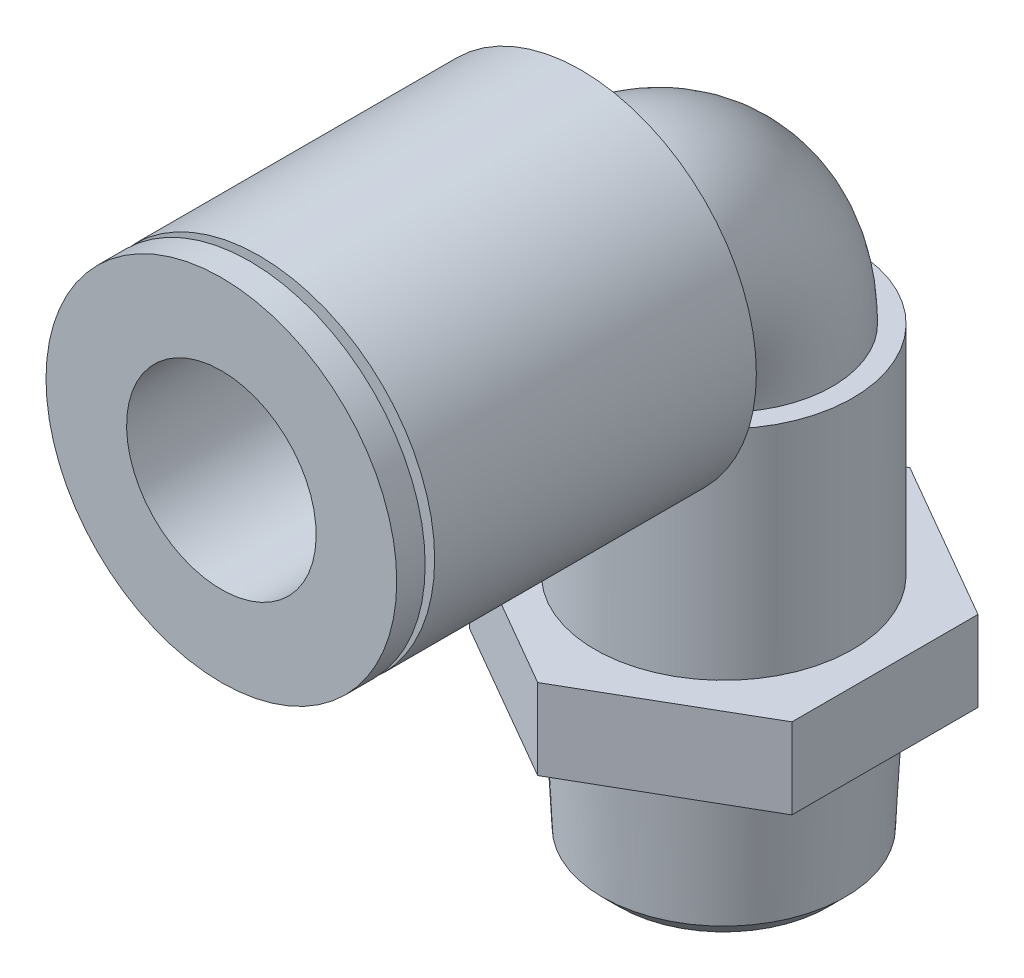
ISO-10303-21;
HEADER;
FILE_DESCRIPTION(('STEP AP214'),'2;1');
FILE_NAME('part.step','',(''),(''),'','','');
FILE_SCHEMA(('AUTOMOTIVE_DESIGN { 1 0 10303 214 1 1 1 1 }'));
ENDSEC;
DATA;
#1=APPLICATION_CONTEXT('core data for automotive mechanical design processes');
#2=APPLICATION_PROTOCOL_DEFINITION('international standard','automotive_design',2000,#1);
#3=PRODUCT_CONTEXT('',#1,'mechanical');
#4=PRODUCT('Part','Part','',(#3));
#5=PRODUCT_RELATED_PRODUCT_CATEGORY('part','',(#4));
#6=PRODUCT_DEFINITION_FORMATION('','',#4);
#7=PRODUCT_DEFINITION_CONTEXT('part definition',#1,'design');
#8=PRODUCT_DEFINITION('design','',#6,#7);
#9=PRODUCT_DEFINITION_SHAPE('','',#8);
#10=(LENGTH_UNIT() NAMED_UNIT(*) SI_UNIT(.MILLI.,.METRE.));
#11=(NAMED_UNIT(*) PLANE_ANGLE_UNIT() SI_UNIT($,.RADIAN.));
#12=(NAMED_UNIT(*) SI_UNIT($,.STERADIAN.) SOLID_ANGLE_UNIT());
#13=UNCERTAINTY_MEASURE_WITH_UNIT(LENGTH_MEASURE(1.E-05),#10,'distance_accuracy_value','');
#14=(GEOMETRIC_REPRESENTATION_CONTEXT(3) GLOBAL_UNCERTAINTY_ASSIGNED_CONTEXT((#13)) GLOBAL_UNIT_ASSIGNED_CONTEXT((#10,
#11,#12)) REPRESENTATION_CONTEXT('',''));
#15=CARTESIAN_POINT('',(0.,0.,0.));
#16=DIRECTION('',(0.,0.,1.));
#17=DIRECTION('',(1.,0.,0.));
#18=AXIS2_PLACEMENT_3D('',#15,#16,#17);
#19=CARTESIAN_POINT('',(-5.,24.9399978917846,5.5));
#20=DIRECTION('',(0.,0.,1.));
#21=DIRECTION('',(1.,0.,0.));
#22=AXIS2_PLACEMENT_3D('',#19,#20,#21);
#23=PLANE('',#22);
#24=CARTESIAN_POINT('',(0.,30.,5.5));
#25=DIRECTION('',(0.,0.,-1.));
#26=DIRECTION('',(0.,1.,0.));
#27=AXIS2_PLACEMENT_3D('',#24,#25,#26);
#28=CIRCLE('',#27,5.);
#29=CARTESIAN_POINT('',(0.,35.,5.5));
#30=VERTEX_POINT('',#29);
#31=EDGE_CURVE('E19',#30,#30,#28,.T.);
#32=ORIENTED_EDGE('',*,*,#31,.F.);
#33=EDGE_LOOP('',(#32));
#34=FACE_BOUND('',#33,.T.);
#35=ADVANCED_FACE('F16',(#34),#23,.T.);
#36=CARTESIAN_POINT('',(0.,30.,26.5));
#37=DIRECTION('',(0.,0.,-1.));
#38=DIRECTION('',(0.,1.,0.));
#39=AXIS2_PLACEMENT_3D('',#36,#37,#38);
#40=CYLINDRICAL_SURFACE('',#39,5.);
#41=ORIENTED_EDGE('',*,*,#31,.T.);
#42=EDGE_LOOP('',(#41));
#43=FACE_BOUND('',#42,.T.);
#44=CARTESIAN_POINT('',(0.,30.,26.5));
#45=DIRECTION('',(0.,0.,-1.));
#46=DIRECTION('',(0.,1.,0.));
#47=AXIS2_PLACEMENT_3D('',#44,#45,#46);
#48=CIRCLE('',#47,5.);
#49=CARTESIAN_POINT('',(0.,35.,26.5));
#50=VERTEX_POINT('',#49);
#51=EDGE_CURVE('E270',#50,#50,#48,.T.);
#52=ORIENTED_EDGE('',*,*,#51,.F.);
#53=EDGE_LOOP('',(#52));
#54=FACE_BOUND('',#53,.T.);
#55=ADVANCED_FACE('F257',(#43,#54),#40,.F.);
#56=CARTESIAN_POINT('',(9.24999999999999,39.3610021083778,26.5));
#57=DIRECTION('',(0.,0.,1.));
#58=DIRECTION('',(-1.,0.,0.));
#59=AXIS2_PLACEMENT_3D('',#56,#57,#58);
#60=PLANE('',#59);
#61=ORIENTED_EDGE('',*,*,#51,.T.);
#62=EDGE_LOOP('',(#61));
#63=FACE_BOUND('',#62,.T.);
#64=CARTESIAN_POINT('',(0.,30.,26.5));
#65=DIRECTION('',(0.,0.,1.));
#66=DIRECTION('',(0.,-1.,0.));
#67=AXIS2_PLACEMENT_3D('',#64,#65,#66);
#68=CIRCLE('',#67,9.25000000000001);
#69=CARTESIAN_POINT('',(0.,20.75,26.5));
#70=VERTEX_POINT('',#69);
#71=EDGE_CURVE('E271',#70,#70,#68,.F.);
#72=ORIENTED_EDGE('',*,*,#71,.F.);
#73=EDGE_LOOP('',(#72));
#74=FACE_BOUND('',#73,.T.);
#75=ADVANCED_FACE('F254',(#63,#74),#60,.T.);
#76=CARTESIAN_POINT('',(5.50308506641006,0.,5.56912419543574));
#77=DIRECTION('',(0.,-1.,0.));
#78=DIRECTION('',(-1.,0.,0.));
#79=AXIS2_PLACEMENT_3D('',#76,#77,#78);
#80=PLANE('',#79);
#81=CARTESIAN_POINT('',(0.,0.,0.));
#82=DIRECTION('',(0.,1.,0.));
#83=DIRECTION('',(0.,0.,1.));
#84=AXIS2_PLACEMENT_3D('',#81,#82,#83);
#85=CIRCLE('',#84,5.50308506641005);
#86=CARTESIAN_POINT('',(0.,0.,5.50308506641005));
#87=VERTEX_POINT('',#86);
#88=EDGE_CURVE('E273',#87,#87,#85,.T.);
#89=ORIENTED_EDGE('',*,*,#88,.F.);
#90=EDGE_LOOP('',(#89));
#91=FACE_BOUND('',#90,.T.);
#92=ADVANCED_FACE('F250',(#91),#80,.T.);
#93=CARTESIAN_POINT('',(0.,30.,26.5));
#94=DIRECTION('',(0.,0.,1.));
#95=DIRECTION('',(0.,-1.,0.));
#96=AXIS2_PLACEMENT_3D('',#93,#94,#95);
#97=CYLINDRICAL_SURFACE('',#96,9.25000000000001);
#98=ORIENTED_EDGE('',*,*,#71,.T.);
#99=EDGE_LOOP('',(#98));
#100=FACE_BOUND('',#99,.T.);
#101=CARTESIAN_POINT('',(0.,30.,25.));
#102=DIRECTION('',(0.,0.,1.));
#103=DIRECTION('',(0.,-1.,0.));
#104=AXIS2_PLACEMENT_3D('',#101,#102,#103);
#105=CIRCLE('',#104,9.25000000000001);
#106=CARTESIAN_POINT('',(0.,20.75,25.));
#107=VERTEX_POINT('',#106);
#108=EDGE_CURVE('E144',#107,#107,#105,.F.);
#109=ORIENTED_EDGE('',*,*,#108,.F.);
#110=EDGE_LOOP('',(#109));
#111=FACE_BOUND('',#110,.T.);
#112=ADVANCED_FACE('F246',(#100,#111),#97,.T.);
#113=CARTESIAN_POINT('',(0.,0.,0.));
#114=DIRECTION('',(0.,1.,0.));
#115=DIRECTION('',(0.,0.,1.));
#116=AXIS2_PLACEMENT_3D('',#113,#114,#115);
#117=CONICAL_SURFACE('',#116,5.50308506641005,0.785398163397449);
#118=CARTESIAN_POINT('',(0.,0.90230008223203,0.));
#119=DIRECTION('',(0.,-1.,0.));
#120=DIRECTION('',(-1.,0.,0.));
#121=AXIS2_PLACEMENT_3D('',#118,#119,#120);
#122=CIRCLE('',#121,6.40538514864208);
#123=CARTESIAN_POINT('',(-6.40538514864208,0.90230008223203,0.));
#124=VERTEX_POINT('',#123);
#125=EDGE_CURVE('E141',#124,#124,#122,.F.);
#126=ORIENTED_EDGE('',*,*,#125,.F.);
#127=EDGE_LOOP('',(#126));
#128=FACE_BOUND('',#127,.T.);
#129=ORIENTED_EDGE('',*,*,#88,.T.);
#130=EDGE_LOOP('',(#129));
#131=FACE_BOUND('',#130,.T.);
#132=ADVANCED_FACE('F242',(#128,#131),#117,.T.);
#133=CARTESIAN_POINT('',(-9.25000000000001,39.3610021083173,25.));
#134=DIRECTION('',(0.,0.,-1.));
#135=DIRECTION('',(1.,0.,0.));
#136=AXIS2_PLACEMENT_3D('',#133,#134,#135);
#137=PLANE('',#136);
#138=CARTESIAN_POINT('',(0.,30.,25.));
#139=DIRECTION('',(0.,0.,1.));
#140=DIRECTION('',(1.,0.,0.));
#141=AXIS2_PLACEMENT_3D('',#138,#139,#140);
#142=CIRCLE('',#141,7.5);
#143=CARTESIAN_POINT('',(7.5,30.,25.));
#144=VERTEX_POINT('',#143);
#145=EDGE_CURVE('E143',#144,#144,#142,.F.);
#146=ORIENTED_EDGE('',*,*,#145,.F.);
#147=EDGE_LOOP('',(#146));
#148=FACE_BOUND('',#147,.T.);
#149=ORIENTED_EDGE('',*,*,#108,.T.);
#150=EDGE_LOOP('',(#149));
#151=FACE_BOUND('',#150,.T.);
#152=ADVANCED_FACE('F238',(#148,#151),#137,.T.);
#153=CARTESIAN_POINT('',(0.,0.90230008223203,0.));
#154=DIRECTION('',(0.,1.,0.));
#155=DIRECTION('',(0.,0.,1.));
#156=AXIS2_PLACEMENT_3D('',#153,#154,#155);
#157=CONICAL_SURFACE('',#156,6.40538514864208,0.05235987755983);
#158=CARTESIAN_POINT('',(0.,8.16,0.));
#159=DIRECTION('',(0.,1.,0.));
#160=DIRECTION('',(0.,0.,1.));
#161=AXIS2_PLACEMENT_3D('',#158,#159,#160);
#162=CIRCLE('',#161,6.78574508403501);
#163=CARTESIAN_POINT('',(0.,8.16,6.78574508403501));
#164=VERTEX_POINT('',#163);
#165=EDGE_CURVE('E282',#164,#164,#162,.T.);
#166=ORIENTED_EDGE('',*,*,#165,.F.);
#167=EDGE_LOOP('',(#166));
#168=FACE_BOUND('',#167,.T.);
#169=ORIENTED_EDGE('',*,*,#125,.T.);
#170=EDGE_LOOP('',(#169));
#171=FACE_BOUND('',#170,.T.);
#172=ADVANCED_FACE('F234',(#168,#171),#157,.T.);
#173=CARTESIAN_POINT('',(0.,30.,25.));
#174=DIRECTION('',(0.,0.,1.));
#175=DIRECTION('',(1.,0.,0.));
#176=AXIS2_PLACEMENT_3D('',#173,#174,#175);
#177=CYLINDRICAL_SURFACE('',#176,7.5);
#178=ORIENTED_EDGE('',*,*,#145,.T.);
#179=EDGE_LOOP('',(#178));
#180=FACE_BOUND('',#179,.T.);
#181=CARTESIAN_POINT('',(0.,30.,24.5));
#182=DIRECTION('',(0.,0.,1.));
#183=DIRECTION('',(1.,0.,0.));
#184=AXIS2_PLACEMENT_3D('',#181,#182,#183);
#185=CIRCLE('',#184,7.5);
#186=CARTESIAN_POINT('',(7.5,30.,24.5));
#187=VERTEX_POINT('',#186);
#188=EDGE_CURVE('E137',#187,#187,#185,.F.);
#189=ORIENTED_EDGE('',*,*,#188,.F.);
#190=EDGE_LOOP('',(#189));
#191=FACE_BOUND('',#190,.T.);
#192=ADVANCED_FACE('F230',(#180,#191),#177,.T.);
#193=CARTESIAN_POINT('',(-8.5,8.16,9.81495457622364));
#194=DIRECTION('',(0.,-1.,0.));
#195=DIRECTION('',(0.,0.,-1.));
#196=AXIS2_PLACEMENT_3D('',#193,#194,#195);
#197=PLANE('',#196);
#198=ORIENTED_EDGE('',*,*,#165,.T.);
#199=EDGE_LOOP('',(#198));
#200=FACE_BOUND('',#199,.T.);
#201=DIRECTION('',(0.866025403784438,0.,-0.5));
#202=VECTOR('',#201,1.);
#203=CARTESIAN_POINT('',(4.25,8.16,7.36121593216773));
#204=LINE('',#203,#202);
#205=CARTESIAN_POINT('',(6.25361147414683E-08,8.16,9.8149545401184));
#206=VERTEX_POINT('',#205);
#207=CARTESIAN_POINT('',(8.5,8.16,4.90747728811182));
#208=VERTEX_POINT('',#207);
#209=EDGE_CURVE('E120',#206,#208,#204,.T.);
#210=ORIENTED_EDGE('',*,*,#209,.F.);
#211=DIRECTION('',(0.866025403784438,0.,0.5));
#212=VECTOR('',#211,1.);
#213=CARTESIAN_POINT('',(-4.25,8.16,7.36121593216773));
#214=LINE('',#213,#212);
#215=CARTESIAN_POINT('',(-8.5,8.16,4.90747728811182));
#216=VERTEX_POINT('',#215);
#217=EDGE_CURVE('E125',#216,#206,#214,.T.);
#218=ORIENTED_EDGE('',*,*,#217,.F.);
#219=DIRECTION('',(0.,0.,1.));
#220=VECTOR('',#219,1.);
#221=CARTESIAN_POINT('',(-8.5,8.16,0.));
#222=LINE('',#221,#220);
#223=CARTESIAN_POINT('',(-8.5,8.16,-4.90747728811182));
#224=VERTEX_POINT('',#223);
#225=EDGE_CURVE('E130',#224,#216,#222,.T.);
#226=ORIENTED_EDGE('',*,*,#225,.F.);
#227=DIRECTION('',(-0.866025403784438,0.,0.5));
#228=VECTOR('',#227,1.);
#229=CARTESIAN_POINT('',(-4.25,8.16,-7.36121593216773));
#230=LINE('',#229,#228);
#231=CARTESIAN_POINT('',(-1.25072228615575E-07,8.16,-9.81495450401316));
#232=VERTEX_POINT('',#231);
#233=EDGE_CURVE('E135',#232,#224,#230,.T.);
#234=ORIENTED_EDGE('',*,*,#233,.F.);
#235=DIRECTION('',(-0.866025403784438,0.,-0.5));
#236=VECTOR('',#235,1.);
#237=CARTESIAN_POINT('',(4.25,8.16,-7.36121593216773));
#238=LINE('',#237,#236);
#239=CARTESIAN_POINT('',(8.5,8.16,-4.90747728811182));
#240=VERTEX_POINT('',#239);
#241=EDGE_CURVE('E85',#240,#232,#238,.T.);
#242=ORIENTED_EDGE('',*,*,#241,.F.);
#243=DIRECTION('',(0.,0.,-1.));
#244=VECTOR('',#243,1.);
#245=CARTESIAN_POINT('',(8.5,8.16,0.));
#246=LINE('',#245,#244);
#247=EDGE_CURVE('E81',#208,#240,#246,.T.);
#248=ORIENTED_EDGE('',*,*,#247,.F.);
#249=EDGE_LOOP('',(#210,#218,#226,#234,#242,#248));
#250=FACE_BOUND('',#249,.T.);
#251=ADVANCED_FACE('F207',(#200,#250),#197,.T.);
#252=CARTESIAN_POINT('',(9.25,39.3610021083173,24.5));
#253=DIRECTION('',(0.,0.,1.));
#254=DIRECTION('',(-1.,0.,0.));
#255=AXIS2_PLACEMENT_3D('',#252,#253,#254);
#256=PLANE('',#255);
#257=ORIENTED_EDGE('',*,*,#188,.T.);
#258=EDGE_LOOP('',(#257));
#259=FACE_BOUND('',#258,.T.);
#260=CARTESIAN_POINT('',(0.,30.,24.5));
#261=DIRECTION('',(0.,0.,1.));
#262=DIRECTION('',(0.,-1.,0.));
#263=AXIS2_PLACEMENT_3D('',#260,#261,#262);
#264=CIRCLE('',#263,9.25000000000001);
#265=CARTESIAN_POINT('',(0.,20.75,24.5));
#266=VERTEX_POINT('',#265);
#267=EDGE_CURVE('E115',#266,#266,#264,.F.);
#268=ORIENTED_EDGE('',*,*,#267,.F.);
#269=EDGE_LOOP('',(#268));
#270=FACE_BOUND('',#269,.T.);
#271=ADVANCED_FACE('F221',(#259,#270),#256,.T.);
#272=CARTESIAN_POINT('',(0.,8.16,-9.81495457622364));
#273=DIRECTION('',(-0.5,0.,-0.866025403784438));
#274=DIRECTION('',(-0.866025403784438,0.,0.5));
#275=AXIS2_PLACEMENT_3D('',#272,#273,#274);
#276=PLANE('',#275);
#277=ORIENTED_EDGE('',*,*,#233,.T.);
#278=DIRECTION('',(0.,1.,0.));
#279=VECTOR('',#278,1.);
#280=CARTESIAN_POINT('',(-8.5,8.16,-4.90747728811182));
#281=LINE('',#280,#279);
#282=CARTESIAN_POINT('',(-8.5,12.41,-4.90747728811182));
#283=VERTEX_POINT('',#282);
#284=EDGE_CURVE('E132',#283,#224,#281,.F.);
#285=ORIENTED_EDGE('',*,*,#284,.F.);
#286=CARTESIAN_POINT('',(0.,12.41,-9.81495457622364));
#287=CARTESIAN_POINT('',(-0.354166666666666,12.41,-9.61047635588565));
#288=CARTESIAN_POINT('',(-0.708333333333333,12.41,-9.40599813554766));
#289=CARTESIAN_POINT('',(-1.41666666666667,12.41,-8.99704169487167));
#290=CARTESIAN_POINT('',(-1.77083333333333,12.41,-8.79256347453368));
#291=CARTESIAN_POINT('',(-2.47916666666667,12.41,-8.3836070338577));
#292=CARTESIAN_POINT('',(-2.83333333333333,12.41,-8.1791288135197));
#293=CARTESIAN_POINT('',(-3.54166666666667,12.41,-7.77017237284372));
#294=CARTESIAN_POINT('',(-3.89583333333333,12.41,-7.56569415250573));
#295=CARTESIAN_POINT('',(-4.60416666666667,12.41,-7.15673771182974));
#296=CARTESIAN_POINT('',(-4.95833333333333,12.41,-6.95225949149175));
#297=CARTESIAN_POINT('',(-5.66666666666667,12.41,-6.54330305081576));
#298=CARTESIAN_POINT('',(-6.02083333333333,12.41,-6.33882483047777));
#299=CARTESIAN_POINT('',(-6.72916666666667,12.41,-5.92986838980178));
#300=CARTESIAN_POINT('',(-7.08333333333333,12.41,-5.72539016946379));
#301=CARTESIAN_POINT('',(-7.79166666666667,12.41,-5.31643372878781));
#302=CARTESIAN_POINT('',(-8.14583333333333,12.41,-5.11195550844982));
#303=CARTESIAN_POINT('',(-8.5,12.41,-4.90747728811182));
#304=B_SPLINE_CURVE_WITH_KNOTS('',3,(#286,#287,#288,#289,#290,#291,#292,#293,#294,#295,#296,
#297,#298,#299,#300,#301,#302,#303),.UNSPECIFIED.,.F.,.F.,(4,2,2,2,2,2,2,2,4),(0.,
1.22686932202796,2.45373864405591,3.68060796608387,4.90747728811182,6.13434661013977,
7.36121593216773,8.58808525419568,9.81495457622364),.UNSPECIFIED.);
#305=CARTESIAN_POINT('',(-6.25361143077874E-08,12.41,-9.8149545401184));
#306=VERTEX_POINT('',#305);
#307=EDGE_CURVE('E110',#306,#283,#304,.T.);
#308=ORIENTED_EDGE('',*,*,#307,.F.);
#309=DIRECTION('',(0.,1.,0.));
#310=VECTOR('',#309,1.);
#311=CARTESIAN_POINT('',(0.,8.16,-9.81495457622364));
#312=LINE('',#311,#310);
#313=EDGE_CURVE('E92',#232,#306,#312,.T.);
#314=ORIENTED_EDGE('',*,*,#313,.F.);
#315=EDGE_LOOP('',(#277,#285,#308,#314));
#316=FACE_BOUND('',#315,.T.);
#317=ADVANCED_FACE('F210',(#316),#276,.T.);
#318=CARTESIAN_POINT('',(-8.5,8.16,-4.90747728811182));
#319=DIRECTION('',(-1.,0.,0.));
#320=DIRECTION('',(0.,0.,1.));
#321=AXIS2_PLACEMENT_3D('',#318,#319,#320);
#322=PLANE('',#321);
#323=ORIENTED_EDGE('',*,*,#225,.T.);
#324=DIRECTION('',(0.,1.,0.));
#325=VECTOR('',#324,1.);
#326=CARTESIAN_POINT('',(-8.5,8.16,4.90747728811182));
#327=LINE('',#326,#325);
#328=CARTESIAN_POINT('',(-8.5,12.41,4.90747728811182));
#329=VERTEX_POINT('',#328);
#330=EDGE_CURVE('E127',#329,#216,#327,.F.);
#331=ORIENTED_EDGE('',*,*,#330,.F.);
#332=DIRECTION('',(0.,0.,1.));
#333=VECTOR('',#332,1.);
#334=CARTESIAN_POINT('',(-8.5,12.41,0.));
#335=LINE('',#334,#333);
#336=EDGE_CURVE('E107',#283,#329,#335,.T.);
#337=ORIENTED_EDGE('',*,*,#336,.F.);
#338=ORIENTED_EDGE('',*,*,#284,.T.);
#339=EDGE_LOOP('',(#323,#331,#337,#338));
#340=FACE_BOUND('',#339,.T.);
#341=ADVANCED_FACE('F212',(#340),#322,.T.);
#342=CARTESIAN_POINT('',(-8.5,8.16,4.90747728811182));
#343=DIRECTION('',(-0.5,0.,0.866025403784438));
#344=DIRECTION('',(0.866025403784438,0.,0.5));
#345=AXIS2_PLACEMENT_3D('',#342,#343,#344);
#346=PLANE('',#345);
#347=ORIENTED_EDGE('',*,*,#217,.T.);
#348=DIRECTION('',(0.,1.,0.));
#349=VECTOR('',#348,1.);
#350=CARTESIAN_POINT('',(0.,8.16,9.81495457622364));
#351=LINE('',#350,#349);
#352=CARTESIAN_POINT('',(-6.25361143077874E-08,12.41,9.8149545401184));
#353=VERTEX_POINT('',#352);
#354=EDGE_CURVE('E122',#353,#206,#351,.F.);
#355=ORIENTED_EDGE('',*,*,#354,.F.);
#356=CARTESIAN_POINT('',(-8.5,12.41,4.90747728811182));
#357=CARTESIAN_POINT('',(-8.14583333333333,12.41,5.11195550844982));
#358=CARTESIAN_POINT('',(-7.79166666666667,12.41,5.31643372878781));
#359=CARTESIAN_POINT('',(-7.08333333333333,12.41,5.72539016946379));
#360=CARTESIAN_POINT('',(-6.72916666666667,12.41,5.92986838980178));
#361=CARTESIAN_POINT('',(-6.02083333333333,12.41,6.33882483047777));
#362=CARTESIAN_POINT('',(-5.66666666666667,12.41,6.54330305081576));
#363=CARTESIAN_POINT('',(-4.95833333333333,12.41,6.95225949149175));
#364=CARTESIAN_POINT('',(-4.60416666666667,12.41,7.15673771182974));
#365=CARTESIAN_POINT('',(-3.89583333333333,12.41,7.56569415250573));
#366=CARTESIAN_POINT('',(-3.54166666666667,12.41,7.77017237284372));
#367=CARTESIAN_POINT('',(-2.83333333333333,12.41,8.1791288135197));
#368=CARTESIAN_POINT('',(-2.47916666666667,12.41,8.3836070338577));
#369=CARTESIAN_POINT('',(-1.77083333333333,12.41,8.79256347453368));
#370=CARTESIAN_POINT('',(-1.41666666666667,12.41,8.99704169487167));
#371=CARTESIAN_POINT('',(-0.708333333333333,12.41,9.40599813554766));
#372=CARTESIAN_POINT('',(-0.354166666666666,12.41,9.61047635588565));
#373=CARTESIAN_POINT('',(0.,12.41,9.81495457622364));
#374=B_SPLINE_CURVE_WITH_KNOTS('',3,(#356,#357,#358,#359,#360,#361,#362,#363,#364,#365,#366,
#367,#368,#369,#370,#371,#372,#373),.UNSPECIFIED.,.F.,.F.,(4,2,2,2,2,2,2,2,4),(0.,
1.22686932202796,2.45373864405591,3.68060796608387,4.90747728811182,6.13434661013978,
7.36121593216773,8.58808525419569,9.81495457622364),.UNSPECIFIED.);
#375=EDGE_CURVE('E102',#329,#353,#374,.T.);
#376=ORIENTED_EDGE('',*,*,#375,.F.);
#377=ORIENTED_EDGE('',*,*,#330,.T.);
#378=EDGE_LOOP('',(#347,#355,#376,#377));
#379=FACE_BOUND('',#378,.T.);
#380=ADVANCED_FACE('F201',(#379),#346,.T.);
#381=CARTESIAN_POINT('',(0.,8.16,9.81495457622364));
#382=DIRECTION('',(0.5,0.,0.866025403784438));
#383=DIRECTION('',(0.866025403784438,0.,-0.5));
#384=AXIS2_PLACEMENT_3D('',#381,#382,#383);
#385=PLANE('',#384);
#386=ORIENTED_EDGE('',*,*,#209,.T.);
#387=DIRECTION('',(0.,1.,0.));
#388=VECTOR('',#387,1.);
#389=CARTESIAN_POINT('',(8.5,8.16,4.90747728811182));
#390=LINE('',#389,#388);
#391=CARTESIAN_POINT('',(8.5,12.41,4.90747728811182));
#392=VERTEX_POINT('',#391);
#393=EDGE_CURVE('E118',#392,#208,#390,.F.);
#394=ORIENTED_EDGE('',*,*,#393,.F.);
#395=CARTESIAN_POINT('',(0.,12.41,9.81495457622364));
#396=CARTESIAN_POINT('',(0.354166666666666,12.41,9.61047635588565));
#397=CARTESIAN_POINT('',(0.708333333333333,12.41,9.40599813554766));
#398=CARTESIAN_POINT('',(1.41666666666667,12.41,8.99704169487167));
#399=CARTESIAN_POINT('',(1.77083333333333,12.41,8.79256347453368));
#400=CARTESIAN_POINT('',(2.47916666666667,12.41,8.3836070338577));
#401=CARTESIAN_POINT('',(2.83333333333333,12.41,8.1791288135197));
#402=CARTESIAN_POINT('',(3.54166666666667,12.41,7.77017237284372));
#403=CARTESIAN_POINT('',(3.89583333333333,12.41,7.56569415250573));
#404=CARTESIAN_POINT('',(4.60416666666667,12.41,7.15673771182974));
#405=CARTESIAN_POINT('',(4.95833333333333,12.41,6.95225949149175));
#406=CARTESIAN_POINT('',(5.66666666666667,12.41,6.54330305081576));
#407=CARTESIAN_POINT('',(6.02083333333333,12.41,6.33882483047777));
#408=CARTESIAN_POINT('',(6.72916666666667,12.41,5.92986838980178));
#409=CARTESIAN_POINT('',(7.08333333333333,12.41,5.72539016946379));
#410=CARTESIAN_POINT('',(7.79166666666667,12.41,5.31643372878781));
#411=CARTESIAN_POINT('',(8.14583333333333,12.41,5.11195550844981));
#412=CARTESIAN_POINT('',(8.5,12.41,4.90747728811182));
#413=B_SPLINE_CURVE_WITH_KNOTS('',3,(#395,#396,#397,#398,#399,#400,#401,#402,#403,#404,#405,
#406,#407,#408,#409,#410,#411,#412),.UNSPECIFIED.,.F.,.F.,(4,2,2,2,2,2,2,2,4),(0.,
1.22686932202796,2.45373864405591,3.68060796608386,4.90747728811182,6.13434661013978,
7.36121593216773,8.58808525419568,9.81495457622364),.UNSPECIFIED.);
#414=EDGE_CURVE('E100',#353,#392,#413,.T.);
#415=ORIENTED_EDGE('',*,*,#414,.F.);
#416=ORIENTED_EDGE('',*,*,#354,.T.);
#417=EDGE_LOOP('',(#386,#394,#415,#416));
#418=FACE_BOUND('',#417,.T.);
#419=ADVANCED_FACE('F205',(#418),#385,.T.);
#420=CARTESIAN_POINT('',(8.5,8.16,4.90747728811182));
#421=DIRECTION('',(1.,0.,0.));
#422=DIRECTION('',(0.,0.,-1.));
#423=AXIS2_PLACEMENT_3D('',#420,#421,#422);
#424=PLANE('',#423);
#425=ORIENTED_EDGE('',*,*,#247,.T.);
#426=DIRECTION('',(0.,1.,0.));
#427=VECTOR('',#426,1.);
#428=CARTESIAN_POINT('',(8.5,8.16,-4.90747728811182));
#429=LINE('',#428,#427);
#430=CARTESIAN_POINT('',(8.5,12.41,-4.90747728811182));
#431=VERTEX_POINT('',#430);
#432=EDGE_CURVE('E73',#431,#240,#429,.F.);
#433=ORIENTED_EDGE('',*,*,#432,.F.);
#434=DIRECTION('',(0.,0.,-1.));
#435=VECTOR('',#434,1.);
#436=CARTESIAN_POINT('',(8.5,12.41,0.));
#437=LINE('',#436,#435);
#438=EDGE_CURVE('E78',#392,#431,#437,.T.);
#439=ORIENTED_EDGE('',*,*,#438,.F.);
#440=ORIENTED_EDGE('',*,*,#393,.T.);
#441=EDGE_LOOP('',(#425,#433,#439,#440));
#442=FACE_BOUND('',#441,.T.);
#443=ADVANCED_FACE('F75',(#442),#424,.T.);
#444=CARTESIAN_POINT('',(8.5,8.16,-4.90747728811182));
#445=DIRECTION('',(0.5,0.,-0.866025403784438));
#446=DIRECTION('',(-0.866025403784438,0.,-0.5));
#447=AXIS2_PLACEMENT_3D('',#444,#445,#446);
#448=PLANE('',#447);
#449=ORIENTED_EDGE('',*,*,#241,.T.);
#450=ORIENTED_EDGE('',*,*,#313,.T.);
#451=CARTESIAN_POINT('',(8.5,12.41,-4.90747728811182));
#452=CARTESIAN_POINT('',(8.14583333333333,12.41,-5.11195550844981));
#453=CARTESIAN_POINT('',(7.79166666666667,12.41,-5.31643372878781));
#454=CARTESIAN_POINT('',(7.08333333333333,12.41,-5.72539016946379));
#455=CARTESIAN_POINT('',(6.72916666666667,12.41,-5.92986838980178));
#456=CARTESIAN_POINT('',(6.02083333333333,12.41,-6.33882483047777));
#457=CARTESIAN_POINT('',(5.66666666666667,12.41,-6.54330305081576));
#458=CARTESIAN_POINT('',(4.95833333333333,12.41,-6.95225949149175));
#459=CARTESIAN_POINT('',(4.60416666666667,12.41,-7.15673771182974));
#460=CARTESIAN_POINT('',(3.89583333333333,12.41,-7.56569415250573));
#461=CARTESIAN_POINT('',(3.54166666666667,12.41,-7.77017237284372));
#462=CARTESIAN_POINT('',(2.83333333333333,12.41,-8.1791288135197));
#463=CARTESIAN_POINT('',(2.47916666666667,12.41,-8.3836070338577));
#464=CARTESIAN_POINT('',(1.77083333333333,12.41,-8.79256347453368));
#465=CARTESIAN_POINT('',(1.41666666666667,12.41,-8.99704169487167));
#466=CARTESIAN_POINT('',(0.708333333333333,12.41,-9.40599813554766));
#467=CARTESIAN_POINT('',(0.354166666666666,12.41,-9.61047635588565));
#468=CARTESIAN_POINT('',(0.,12.41,-9.81495457622364));
#469=B_SPLINE_CURVE_WITH_KNOTS('',3,(#451,#452,#453,#454,#455,#456,#457,#458,#459,#460,#461,
#462,#463,#464,#465,#466,#467,#468),.UNSPECIFIED.,.F.,.F.,(4,2,2,2,2,2,2,2,4),(0.,
1.22686932202796,2.45373864405591,3.68060796608386,4.90747728811182,6.13434661013978,
7.36121593216773,8.58808525419568,9.81495457622364),.UNSPECIFIED.);
#470=EDGE_CURVE('E89',#431,#306,#469,.T.);
#471=ORIENTED_EDGE('',*,*,#470,.F.);
#472=ORIENTED_EDGE('',*,*,#432,.T.);
#473=EDGE_LOOP('',(#449,#450,#471,#472));
#474=FACE_BOUND('',#473,.T.);
#475=ADVANCED_FACE('F90',(#474),#448,.T.);
#476=CARTESIAN_POINT('',(0.,30.,24.5));
#477=DIRECTION('',(0.,0.,1.));
#478=DIRECTION('',(0.,-1.,0.));
#479=AXIS2_PLACEMENT_3D('',#476,#477,#478);
#480=CYLINDRICAL_SURFACE('',#479,9.25000000000001);
#481=CARTESIAN_POINT('',(0.,30.,7.53214199097557));
#482=DIRECTION('',(0.,0.,-1.));
#483=DIRECTION('',(-1.,0.,0.));
#484=AXIS2_PLACEMENT_3D('',#481,#482,#483);
#485=CIRCLE('',#484,9.25);
#486=CARTESIAN_POINT('',(-9.25,30.,7.53214199097557));
#487=VERTEX_POINT('',#486);
#488=EDGE_CURVE('E113',#487,#487,#485,.T.);
#489=ORIENTED_EDGE('',*,*,#488,.F.);
#490=EDGE_LOOP('',(#489));
#491=FACE_BOUND('',#490,.T.);
#492=ORIENTED_EDGE('',*,*,#267,.T.);
#493=EDGE_LOOP('',(#492));
#494=FACE_BOUND('',#493,.T.);
#495=ADVANCED_FACE('F335',(#491,#494),#480,.T.);
#496=CARTESIAN_POINT('',(-8.5,12.41,-9.81495457622364));
#497=DIRECTION('',(0.,1.,0.));
#498=DIRECTION('',(0.,0.,1.));
#499=AXIS2_PLACEMENT_3D('',#496,#497,#498);
#500=PLANE('',#499);
#501=CARTESIAN_POINT('',(0.,12.41,0.));
#502=DIRECTION('',(0.,-1.,0.));
#503=DIRECTION('',(0.,0.,-1.));
#504=AXIS2_PLACEMENT_3D('',#501,#502,#503);
#505=CIRCLE('',#504,6.8);
#506=CARTESIAN_POINT('',(0.,12.41,-6.8));
#507=VERTEX_POINT('',#506);
#508=EDGE_CURVE('E140',#507,#507,#505,.F.);
#509=ORIENTED_EDGE('',*,*,#508,.F.);
#510=EDGE_LOOP('',(#509));
#511=FACE_BOUND('',#510,.T.);
#512=ORIENTED_EDGE('',*,*,#438,.T.);
#513=ORIENTED_EDGE('',*,*,#470,.T.);
#514=ORIENTED_EDGE('',*,*,#307,.T.);
#515=ORIENTED_EDGE('',*,*,#336,.T.);
#516=ORIENTED_EDGE('',*,*,#375,.T.);
#517=ORIENTED_EDGE('',*,*,#414,.T.);
#518=EDGE_LOOP('',(#512,#513,#514,#515,#516,#517));
#519=FACE_BOUND('',#518,.T.);
#520=ADVANCED_FACE('F97',(#511,#519),#500,.T.);
#521=CARTESIAN_POINT('',(0.,30.,6.625));
#522=DIRECTION('',(0.,0.,1.));
#523=DIRECTION('',(1.,0.,0.));
#524=AXIS2_PLACEMENT_3D('',#521,#522,#523);
#525=CYLINDRICAL_SURFACE('',#524,5.8645);
#526=CARTESIAN_POINT('',(0.,30.,6.625));
#527=DIRECTION('',(0.,0.,-1.));
#528=DIRECTION('',(-1.,0.,0.));
#529=AXIS2_PLACEMENT_3D('',#526,#527,#528);
#530=CIRCLE('',#529,5.8645);
#531=CARTESIAN_POINT('',(-5.8645,30.,6.625));
#532=VERTEX_POINT('',#531);
#533=EDGE_CURVE('E95',#532,#532,#530,.F.);
#534=ORIENTED_EDGE('',*,*,#533,.F.);
#535=EDGE_LOOP('',(#534));
#536=FACE_BOUND('',#535,.T.);
#537=CARTESIAN_POINT('',(0.,30.,5.91999999999999));
#538=DIRECTION('',(0.,0.,1.));
#539=DIRECTION('',(1.,0.,0.));
#540=AXIS2_PLACEMENT_3D('',#537,#538,#539);
#541=CIRCLE('',#540,5.8645);
#542=CARTESIAN_POINT('',(5.8645,30.,5.91999999999999));
#543=VERTEX_POINT('',#542);
#544=EDGE_CURVE('E298',#543,#543,#541,.F.);
#545=ORIENTED_EDGE('',*,*,#544,.F.);
#546=EDGE_LOOP('',(#545));
#547=FACE_BOUND('',#546,.T.);
#548=ADVANCED_FACE('F180',(#536,#547),#525,.T.);
#549=CARTESIAN_POINT('',(0.,30.,6.625));
#550=DIRECTION('',(0.,0.,1.));
#551=DIRECTION('',(1.,0.,0.));
#552=AXIS2_PLACEMENT_3D('',#549,#550,#551);
#553=CONICAL_SURFACE('',#552,5.8645,1.30899693899575);
#554=ORIENTED_EDGE('',*,*,#533,.T.);
#555=EDGE_LOOP('',(#554));
#556=FACE_BOUND('',#555,.T.);
#557=CARTESIAN_POINT('',(-1.07442526692499,23.895,6.71458175225307));
#558=CARTESIAN_POINT('',(-0.89543532940602,23.895,6.706252165456));
#559=CARTESIAN_POINT('',(-0.716347919385816,23.895,6.6999660120934));
#560=CARTESIAN_POINT('',(-0.358173637386177,23.895,6.69156195879045));
#561=CARTESIAN_POINT('',(-0.179086818693086,23.895,6.68944178077969));
#562=CARTESIAN_POINT('',(0.179086818693095,23.895,6.68944178077969));
#563=CARTESIAN_POINT('',(0.358173637386186,23.895,6.69156195879045));
#564=CARTESIAN_POINT('',(0.716347919385824,23.895,6.6999660120934));
#565=CARTESIAN_POINT('',(0.895435329406028,23.895,6.70625216545601));
#566=CARTESIAN_POINT('',(1.074425266925,23.895,6.71458175225307));
#567=B_SPLINE_CURVE_WITH_KNOTS('',3,(#557,#558,#559,#560,#561,#562,#563,#564,#565,#566),
.UNSPECIFIED.,.F.,.F.,(4,2,2,2,4),(0.,0.537542998483702,1.07479197171322,1.61204094494273,
2.14958394342643),.UNSPECIFIED.);
#568=CARTESIAN_POINT('',(-1.07442542591673,23.8949998086158,6.71458181014216));
#569=VERTEX_POINT('',#568);
#570=CARTESIAN_POINT('',(1.07442582953628,23.8949998086158,6.71458182888742));
#571=VERTEX_POINT('',#570);
#572=EDGE_CURVE('E320',#569,#571,#567,.T.);
#573=ORIENTED_EDGE('',*,*,#572,.F.);
#574=CARTESIAN_POINT('',(1.07442558490846,23.8949996172317,6.71458186803126));
#575=CARTESIAN_POINT('',(1.00124495070039,23.8377597172597,6.72628814116354));
#576=CARTESIAN_POINT('',(0.924656266080018,23.784136951984,6.7373187581042));
#577=CARTESIAN_POINT('',(0.763812049261365,23.6865917219806,6.75746085254749));
#578=CARTESIAN_POINT('',(0.679461122042706,23.6428218655184,6.7665420481229));
#579=CARTESIAN_POINT('',(0.503680150295565,23.5690063004151,6.78189611371323));
#580=CARTESIAN_POINT('',(0.412198264167335,23.5390747175855,6.7881456223574));
#581=CARTESIAN_POINT('',(0.225645572238345,23.4972425102807,6.79688865859886));
#582=CARTESIAN_POINT('',(0.130608924610403,23.4852009734508,6.79941153836266));
#583=CARTESIAN_POINT('',(-0.0496165873920742,23.4807150082309,6.80035103896316));
#584=CARTESIAN_POINT('',(-0.134757758905731,23.4862901854427,6.79918262230166));
#585=CARTESIAN_POINT('',(-0.303231881925116,23.5121953244501,6.79376281247439));
#586=CARTESIAN_POINT('',(-0.3865476581387,23.5326299827789,6.78948954339855));
#587=CARTESIAN_POINT('',(-0.57886402695185,23.5961843034424,6.77623591802941));
#588=CARTESIAN_POINT('',(-0.685866182794823,23.6449198091624,6.76609488667524));
#589=CARTESIAN_POINT('',(-0.888527209639016,23.759120399932,6.74246850668589));
#590=CARTESIAN_POINT('',(-0.984310257595407,23.8243706006196,6.7290261756459));
#591=CARTESIAN_POINT('',(-1.07442558490846,23.8949996172317,6.71458186803126));
#592=B_SPLINE_CURVE_WITH_KNOTS('',3,(#574,#575,#576,#577,#578,#579,#580,#581,#582,#583,#584,
#585,#586,#587,#588,#589,#590,#591),.UNSPECIFIED.,.F.,.F.,(4,2,2,2,2,2,2,2,4),(0.,
0.281359951364204,0.566816608711618,0.854587214763224,1.14007892896847,1.39466430176144,
1.65106102301845,2.0030038873657,2.35058375877076),.UNSPECIFIED.);
#593=EDGE_CURVE('E291',#571,#569,#592,.T.);
#594=ORIENTED_EDGE('',*,*,#593,.F.);
#595=EDGE_LOOP('',(#573,#594));
#596=FACE_BOUND('',#595,.T.);
#597=ORIENTED_EDGE('',*,*,#488,.T.);
#598=EDGE_LOOP('',(#597));
#599=FACE_BOUND('',#598,.T.);
#600=ADVANCED_FACE('F300',(#556,#596,#599),#553,.T.);
#601=CARTESIAN_POINT('',(0.,12.41,0.));
#602=DIRECTION('',(0.,-1.,0.));
#603=DIRECTION('',(0.,0.,-1.));
#604=AXIS2_PLACEMENT_3D('',#601,#602,#603);
#605=CYLINDRICAL_SURFACE('',#604,6.8);
#606=ORIENTED_EDGE('',*,*,#508,.T.);
#607=EDGE_LOOP('',(#606));
#608=FACE_BOUND('',#607,.T.);
#609=ORIENTED_EDGE('',*,*,#593,.T.);
#610=CARTESIAN_POINT('',(0.,23.895,0.));
#611=DIRECTION('',(0.,-1.,0.));
#612=DIRECTION('',(0.,0.,-1.));
#613=AXIS2_PLACEMENT_3D('',#610,#611,#612);
#614=CIRCLE('',#613,6.8);
#615=EDGE_CURVE('E31',#571,#569,#614,.F.);
#616=ORIENTED_EDGE('',*,*,#615,.F.);
#617=EDGE_LOOP('',(#609,#616));
#618=FACE_BOUND('',#617,.T.);
#619=ADVANCED_FACE('F302',(#608,#618),#605,.T.);
#620=CARTESIAN_POINT('',(-5.8645,35.9348761083048,5.92));
#621=DIRECTION('',(0.,0.,-1.));
#622=DIRECTION('',(1.,0.,0.));
#623=AXIS2_PLACEMENT_3D('',#620,#621,#622);
#624=PLANE('',#623);
#625=CARTESIAN_POINT('',(0.,35.7335545992744,5.92));
#626=CARTESIAN_POINT('',(0.322311838310714,35.7335473594728,5.92));
#627=CARTESIAN_POINT('',(0.644709295881566,35.7063049958976,5.92));
#628=CARTESIAN_POINT('',(1.28045373429589,35.5980671335138,5.92));
#629=CARTESIAN_POINT('',(1.5937966086049,35.5170476323265,5.92));
#630=CARTESIAN_POINT('',(2.20238487459136,35.3035614506607,5.92));
#631=CARTESIAN_POINT('',(2.49763353353031,35.1711040901646,5.92));
#632=CARTESIAN_POINT('',(3.06167423000063,34.8585146890041,5.92));
#633=CARTESIAN_POINT('',(3.33046857307572,34.6783868079724,5.92));
#634=CARTESIAN_POINT('',(3.83402487958215,34.2755513497905,5.92));
#635=CARTESIAN_POINT('',(4.06878438332379,34.052840697888,5.92));
#636=CARTESIAN_POINT('',(4.49758857945795,33.5711689977486,5.92));
#637=CARTESIAN_POINT('',(4.69163280394632,33.3122075329706,5.92));
#638=CARTESIAN_POINT('',(5.03351832467292,32.7653602161916,5.92));
#639=CARTESIAN_POINT('',(5.18135490517419,32.4774714159608,5.92));
#640=CARTESIAN_POINT('',(5.42661019686229,31.8809630946295,5.92));
#641=CARTESIAN_POINT('',(5.52402861492322,31.5723434530138,5.92));
#642=CARTESIAN_POINT('',(5.66571031386797,30.9430570065499,5.92));
#643=CARTESIAN_POINT('',(5.7099607497204,30.622387309778,5.92));
#644=CARTESIAN_POINT('',(5.74402436862871,29.9781788921623,5.92));
#645=CARTESIAN_POINT('',(5.73383889600296,29.6546402423656,5.92));
#646=CARTESIAN_POINT('',(5.65933062900369,29.0137058392177,5.92));
#647=CARTESIAN_POINT('',(5.59498256956574,28.6963130233921,5.92));
#648=CARTESIAN_POINT('',(5.41397205544748,28.0767818964561,5.92));
#649=CARTESIAN_POINT('',(5.29730425720483,27.7746451469984,5.92));
#650=CARTESIAN_POINT('',(5.01482198607099,27.193779011688,5.92));
#651=CARTESIAN_POINT('',(4.84893986699007,26.9150825262059,5.92));
#652=CARTESIAN_POINT('',(4.47296528562698,26.3894817672655,5.92));
#653=CARTESIAN_POINT('',(4.26288939114896,26.1425656354266,5.92));
#654=CARTESIAN_POINT('',(3.80379421257596,25.6864120001246,5.92));
#655=CARTESIAN_POINT('',(3.55464845203099,25.4773017877677,5.92));
#656=CARTESIAN_POINT('',(3.02493016060591,25.1030602727313,5.92));
#657=CARTESIAN_POINT('',(2.74432091178279,24.9379811293122,5.92));
#658=CARTESIAN_POINT('',(2.15537941886672,24.6535989519738,5.92));
#659=CARTESIAN_POINT('',(1.84669158081574,24.5350273068153,5.92));
#660=CARTESIAN_POINT('',(1.37291174723317,24.3965160375167,5.92));
#661=CARTESIAN_POINT('',(1.21330548999303,24.3569168422794,5.92));
#662=CARTESIAN_POINT('',(0.891327024807792,24.2914795360308,5.92));
#663=CARTESIAN_POINT('',(0.728957025299509,24.2656309251566,5.92));
#664=CARTESIAN_POINT('',(0.471818737394409,24.2368451351997,5.92));
#665=CARTESIAN_POINT('',(0.377595397369568,24.2288402182073,5.92));
#666=CARTESIAN_POINT('',(0.188916539992005,24.2181332530815,5.92));
#667=CARTESIAN_POINT('',(0.0944612711621313,24.2154269335978,5.92));
#668=CARTESIAN_POINT('',(-0.123694621667058,24.2154326283056,5.92));
#669=CARTESIAN_POINT('',(-0.247399535673398,24.2200806745937,5.92));
#670=CARTESIAN_POINT('',(-0.494269044287904,24.2383517334525,5.92));
#671=CARTESIAN_POINT('',(-0.617432816164443,24.2519854687186,5.92));
#672=CARTESIAN_POINT('',(-0.903016850730823,24.2934182991156,5.92));
#673=CARTESIAN_POINT('',(-1.06497836455607,24.3244073544598,5.92));
#674=CARTESIAN_POINT('',(-1.38579915348356,24.399881142569,5.92));
#675=CARTESIAN_POINT('',(-1.54465643012409,24.4443742829448,5.92));
#676=CARTESIAN_POINT('',(-1.85845589330204,24.5463869436725,5.92));
#677=CARTESIAN_POINT('',(-2.01339041185391,24.6039300713824,5.92));
#678=CARTESIAN_POINT('',(-2.31792748230681,24.7316369585507,5.92));
#679=CARTESIAN_POINT('',(-2.46753125922765,24.8017977957187,5.92));
#680=CARTESIAN_POINT('',(-2.76074646782568,24.9545806257471,5.92));
#681=CARTESIAN_POINT('',(-2.90434087919543,25.03723530826,5.92));
#682=CARTESIAN_POINT('',(-3.18408467290979,25.2144152042246,5.92));
#683=CARTESIAN_POINT('',(-3.32023138071758,25.308944642356,5.92));
#684=CARTESIAN_POINT('',(-3.58383066249929,25.5091219729293,5.92));
#685=CARTESIAN_POINT('',(-3.71129362049538,25.6147561875472,5.92));
#686=CARTESIAN_POINT('',(-3.95678347980688,25.8365610504387,5.92));
#687=CARTESIAN_POINT('',(-4.07480693186283,25.9527355173948,5.92));
#688=CARTESIAN_POINT('',(-4.29964022670527,26.1938813020144,5.92));
#689=CARTESIAN_POINT('',(-4.4065259125721,26.3187819094636,5.92));
#690=CARTESIAN_POINT('',(-4.60930035058083,26.5772886691136,5.92));
#691=CARTESIAN_POINT('',(-4.70518498367927,26.7108980529063,5.92));
#692=CARTESIAN_POINT('',(-4.88518167196277,26.9858026251352,5.92));
#693=CARTESIAN_POINT('',(-4.96929508754414,27.1270969228028,5.92));
#694=CARTESIAN_POINT('',(-5.12516156272833,27.4164144972113,5.92));
#695=CARTESIAN_POINT('',(-5.19691006188678,27.5644402313176,5.92));
#696=CARTESIAN_POINT('',(-5.32658243775872,27.8640375835285,5.92));
#697=CARTESIAN_POINT('',(-5.38468105452298,28.0155336014572,5.92));
#698=CARTESIAN_POINT('',(-5.48788750112145,28.322950457122,5.92));
#699=CARTESIAN_POINT('',(-5.53299057077127,28.4788728933114,5.92));
#700=CARTESIAN_POINT('',(-5.60982876580409,28.793897298887,5.92));
#701=CARTESIAN_POINT('',(-5.64157036398562,28.952997689534,5.92));
#702=CARTESIAN_POINT('',(-5.69149415802793,29.2733721357458,5.92));
#703=CARTESIAN_POINT('',(-5.7096713522376,29.4346469708077,5.92));
#704=CARTESIAN_POINT('',(-5.73226783686898,29.7575234511873,5.92));
#705=CARTESIAN_POINT('',(-5.73674069553682,29.9191213469381,5.92));
#706=CARTESIAN_POINT('',(-5.73204599402899,30.2421758037405,5.92));
#707=CARTESIAN_POINT('',(-5.72287340834904,30.403632290797,5.92));
#708=CARTESIAN_POINT('',(-5.69094023943765,30.7251497498912,5.92));
#709=CARTESIAN_POINT('',(-5.66818445748253,30.8852111947634,5.92));
#710=CARTESIAN_POINT('',(-5.60926355022354,31.2028630816867,5.92));
#711=CARTESIAN_POINT('',(-5.57309348000653,31.3604525901505,5.92));
#712=CARTESIAN_POINT('',(-5.44490650401656,31.8273178072083,5.91999999999999));
#713=CARTESIAN_POINT('',(-5.33313884942249,32.1314277068651,5.92));
#714=CARTESIAN_POINT('',(-5.06016450428951,32.7163787110806,5.92));
#715=CARTESIAN_POINT('',(-4.89895879510275,32.9972202773783,5.92));
#716=CARTESIAN_POINT('',(-4.53174208011552,33.5277389752655,5.92));
#717=CARTESIAN_POINT('',(-4.32575432067151,33.7774321705273,5.92));
#718=CARTESIAN_POINT('',(-3.87475636074149,34.2386928735097,5.92));
#719=CARTESIAN_POINT('',(-3.62974277711981,34.450257072448,5.92));
#720=CARTESIAN_POINT('',(-3.10768730754075,34.8292264585508,5.92));
#721=CARTESIAN_POINT('',(-2.83064678002875,34.9966335176837,5.92));
#722=CARTESIAN_POINT('',(-2.25246987869856,35.2824835204347,5.92));
#723=CARTESIAN_POINT('',(-1.95134433668868,35.400948328812,5.92));
#724=CARTESIAN_POINT('',(-1.37645494125574,35.5728304342916,5.92));
#725=CARTESIAN_POINT('',(-1.10468288675442,35.6329873362928,5.92));
#726=CARTESIAN_POINT('',(-0.555295070175467,35.7133525330032,5.92));
#727=CARTESIAN_POINT('',(-0.27767930938847,35.7335608365354,5.92));
#728=CARTESIAN_POINT('',(0.,35.7335545992744,5.92));
#729=B_SPLINE_CURVE_WITH_KNOTS('',3,(#625,#626,#627,#628,#629,#630,#631,#632,#633,#634,#635,
#636,#637,#638,#639,#640,#641,#642,#643,#644,#645,#646,#647,#648,#649,#650,#651,#652,#653,#654,
#655,#656,#657,#658,#659,#660,#661,#662,#663,#664,#665,#666,#667,#668,#669,#670,#671,#672,#673,
#674,#675,#676,#677,#678,#679,#680,#681,#682,#683,#684,#685,#686,#687,#688,#689,#690,#691,#692,
#693,#694,#695,#696,#697,#698,#699,#700,#701,#702,#703,#704,#705,#706,#707,#708,#709,#710,#711,
#712,#713,#714,#715,#716,#717,#718,#719,#720,#721,#722,#723,#724,#725,#726,#727,#728),
.UNSPECIFIED.,.T.,.F.,(4,2,2,2,2,2,2,2,2,2,2,2,2,2,2,2,2,2,2,2,2,2,2,2,2,2,2,2,2,2,2,2,2,2,2,2,
2,2,2,2,2,2,2,2,2,2,2,2,2,2,2,4),(0.,0.965942763191388,1.93231694630201,2.89851611452472,
3.86463100195476,4.83081567550908,5.79701145194815,6.76330580165665,7.72960576923603,
8.69613914155944,9.66264864503245,10.6296092433975,11.5966686226729,12.5650634542307,
13.5330958891586,14.5043293006745,15.4767081775668,16.4638184283048,16.9567065248731,
17.4492177128641,17.7327788346214,18.0161112754119,18.3871278691801,18.7585880036204,
19.2526375476627,19.7469953189392,20.2422546169595,20.7373993591619,21.2338628006507,
21.7305033717445,22.2265392398659,22.7227555425283,23.2153351764664,23.7080986456127,
24.2008051191107,24.6936929261375,25.1798776338445,25.6662402021063,26.152366886168,
26.6386727330048,27.1230752403915,27.607656193387,28.0920659620449,28.5766544766018,
29.5436359883987,30.5105983067221,31.4770598684876,32.4436052581282,33.410109666097,
34.3761818238711,35.2083646566108,36.0405473055559),.UNSPECIFIED.);
#730=CARTESIAN_POINT('',(0.,35.7335545992744,5.92));
#731=VERTEX_POINT('',#730);
#732=EDGE_CURVE('E25',#731,#731,#729,.T.);
#733=ORIENTED_EDGE('',*,*,#732,.F.);
#734=EDGE_LOOP('',(#733));
#735=FACE_BOUND('',#734,.T.);
#736=ORIENTED_EDGE('',*,*,#544,.T.);
#737=EDGE_LOOP('',(#736));
#738=FACE_BOUND('',#737,.T.);
#739=ADVANCED_FACE('F305',(#735,#738),#624,.T.);
#740=CARTESIAN_POINT('',(-6.8,23.895,6.79566929298153));
#741=DIRECTION('',(0.,1.,0.));
#742=DIRECTION('',(1.,0.,0.));
#743=AXIS2_PLACEMENT_3D('',#740,#741,#742);
#744=PLANE('',#743);
#745=CARTESIAN_POINT('',(-5.735,23.895,0.));
#746=CARTESIAN_POINT('',(-5.73499475783302,23.895,0.272741036353396));
#747=CARTESIAN_POINT('',(-5.71550960324835,23.895,0.545563925458954));
#748=CARTESIAN_POINT('',(-5.63786177770999,23.895,1.08595631953304));
#749=CARTESIAN_POINT('',(-5.57966179854382,23.895,1.3535205005443));
#750=CARTESIAN_POINT('',(-5.45736807241803,23.895,1.77014402988386));
#751=CARTESIAN_POINT('',(-5.40543818675072,23.895,1.92288049417625));
#752=CARTESIAN_POINT('',(-5.2888856642796,23.895,2.2234838607979));
#753=CARTESIAN_POINT('',(-5.22426150796605,23.895,2.37135017769176));
#754=CARTESIAN_POINT('',(-5.08278570406595,23.895,2.66111221856342));
#755=CARTESIAN_POINT('',(-5.00593351657365,23.895,2.80300767855927));
#756=CARTESIAN_POINT('',(-4.84052079516189,23.895,3.07986895519526));
#757=CARTESIAN_POINT('',(-4.75195632926741,23.895,3.21483242344991));
#758=CARTESIAN_POINT('',(-4.56379771355393,23.895,3.47677624827184));
#759=CARTESIAN_POINT('',(-4.4642068823354,23.895,3.60375898885549));
#760=CARTESIAN_POINT('',(-4.25468192626019,23.895,3.84888335754401));
#761=CARTESIAN_POINT('',(-4.14474780836475,23.895,3.96702499159904));
#762=CARTESIAN_POINT('',(-3.91529864541616,23.895,4.19364600799482));
#763=CARTESIAN_POINT('',(-3.79578200893129,23.895,4.30212377905281));
#764=CARTESIAN_POINT('',(-3.5480770084537,23.895,4.50858758472202));
#765=CARTESIAN_POINT('',(-3.41989167259182,23.895,4.60657725243726));
#766=CARTESIAN_POINT('',(-3.15566041716859,23.895,4.79145523952023));
#767=CARTESIAN_POINT('',(-3.01961082999676,23.895,4.87833831750805));
#768=CARTESIAN_POINT('',(-2.74072613326682,23.895,5.04030161301722));
#769=CARTESIAN_POINT('',(-2.59789347934565,23.895,5.11538606015014));
#770=CARTESIAN_POINT('',(-2.30639962537443,23.895,5.25325942238995));
#771=CARTESIAN_POINT('',(-2.15773823519549,23.895,5.3160479360118));
#772=CARTESIAN_POINT('',(-1.85570278012779,23.895,5.42886673147947));
#773=CARTESIAN_POINT('',(-1.70232945822681,23.895,5.47889901330375));
#774=CARTESIAN_POINT('',(-1.29555097229895,23.895,5.5928469575995));
#775=CARTESIAN_POINT('',(-1.03909112525799,23.895,5.64613344460828));
#776=CARTESIAN_POINT('',(-0.521692517998636,23.895,5.71717833637342));
#777=CARTESIAN_POINT('',(-0.260761612299429,23.895,5.7349936612191));
#778=CARTESIAN_POINT('',(0.123682726768406,23.895,5.73500300656872));
#779=CARTESIAN_POINT('',(0.247327367058777,23.895,5.73099946853818));
#780=CARTESIAN_POINT('',(0.494150757094974,23.895,5.71500901417222));
#781=CARTESIAN_POINT('',(0.617329357725072,23.895,5.70301972949936));
#782=CARTESIAN_POINT('',(0.899693635548703,23.895,5.66627814343334));
#783=CARTESIAN_POINT('',(1.05852643187596,23.895,5.63876594173404));
#784=CARTESIAN_POINT('',(1.37337558893772,23.895,5.57046028351448));
#785=CARTESIAN_POINT('',(1.52939066862001,23.895,5.52966093893335));
#786=CARTESIAN_POINT('',(1.8376581622454,23.895,5.43500422791624));
#787=CARTESIAN_POINT('',(1.98990478953896,23.895,5.38112800464894));
#788=CARTESIAN_POINT('',(2.28936940628806,23.895,5.26070982351469));
#789=CARTESIAN_POINT('',(2.43658549660981,23.895,5.1941631432512));
#790=CARTESIAN_POINT('',(2.72472317826724,23.895,5.04897079095378));
#791=CARTESIAN_POINT('',(2.86565148017867,23.895,4.97033843606654));
#792=CARTESIAN_POINT('',(3.14043356821418,23.895,4.80144964979579));
#793=CARTESIAN_POINT('',(3.27428472459593,23.895,4.71118893974276));
#794=CARTESIAN_POINT('',(3.53380291537207,23.895,4.51978298645258));
#795=CARTESIAN_POINT('',(3.65947624266162,23.895,4.41864627523048));
#796=CARTESIAN_POINT('',(3.90190464077386,23.895,4.20610990330085));
#797=CARTESIAN_POINT('',(4.01865640357521,23.895,4.09470646925339));
#798=CARTESIAN_POINT('',(4.24233772283601,23.895,3.86248374114315));
#799=CARTESIAN_POINT('',(4.34926924737171,23.895,3.74166634274601));
#800=CARTESIAN_POINT('',(4.5526142635049,23.895,3.49140838120751));
#801=CARTESIAN_POINT('',(4.64902385634411,23.895,3.36196465011737));
#802=CARTESIAN_POINT('',(4.83056713069245,23.895,3.09545393014694));
#803=CARTESIAN_POINT('',(4.91570413389781,23.895,2.95838920392666));
#804=CARTESIAN_POINT('',(5.07415994270886,23.895,2.67752383075183));
#805=CARTESIAN_POINT('',(5.1474743730108,23.895,2.53372071534374));
#806=CARTESIAN_POINT('',(5.2816984693137,23.895,2.24050737191749));
#807=CARTESIAN_POINT('',(5.34261311304445,23.895,2.09109942252461));
#808=CARTESIAN_POINT('',(5.45166196764308,23.895,1.78762787986203));
#809=CARTESIAN_POINT('',(5.49979145184842,23.895,1.63356258815676));
#810=CARTESIAN_POINT('',(5.58288210504154,23.895,1.32198251150839));
#811=CARTESIAN_POINT('',(5.61784822549793,23.895,1.16446904725274));
#812=CARTESIAN_POINT('',(5.67440078229337,23.895,0.84700114963189));
#813=CARTESIAN_POINT('',(5.69598227411144,23.895,0.687045836535599));
#814=CARTESIAN_POINT('',(5.72558225292962,23.895,0.365932685745892));
#815=CARTESIAN_POINT('',(5.73360568210827,23.895,0.20477530775396));
#816=CARTESIAN_POINT('',(5.73606348429101,23.895,-0.117659023096134));
#817=CARTESIAN_POINT('',(5.73049283910024,23.895,-0.278935998134195));
#818=CARTESIAN_POINT('',(5.693382354267,23.895,-0.761098517758243));
#819=CARTESIAN_POINT('',(5.64147586787791,23.895,-1.08066520863535));
#820=CARTESIAN_POINT('',(5.4847685277367,23.895,-1.70637365905411));
#821=CARTESIAN_POINT('',(5.37996751026685,23.895,-2.01251537703996));
#822=CARTESIAN_POINT('',(5.12045143811016,23.895,-2.60290463734585));
#823=CARTESIAN_POINT('',(4.96573661990538,23.895,-2.88715228338793));
#824=CARTESIAN_POINT('',(4.61078652952096,23.895,-3.42562082893269));
#825=CARTESIAN_POINT('',(4.41055214976128,23.895,-3.67984231695566));
#826=CARTESIAN_POINT('',(3.97023719016137,23.895,-4.15107525633109));
#827=CARTESIAN_POINT('',(3.7301548596414,23.895,-4.36808507197401));
#828=CARTESIAN_POINT('',(3.21693601149672,23.895,-4.75873411259028));
#829=CARTESIAN_POINT('',(2.94379641933194,23.895,-4.93236929883255));
#830=CARTESIAN_POINT('',(2.37232303554751,23.895,-5.2312803377152));
#831=CARTESIAN_POINT('',(2.07399505503103,23.895,-5.35656730760808));
#832=CARTESIAN_POINT('',(1.48233409657018,23.895,-5.54820049997239));
#833=CARTESIAN_POINT('',(1.1901593798501,23.895,-5.61810986707209));
#834=CARTESIAN_POINT('',(0.746639708114434,23.895,-5.68816787285922));
#835=CARTESIAN_POINT('',(0.597854754751499,23.895,-5.70571958713279));
#836=CARTESIAN_POINT('',(0.299380011918778,23.895,-5.72913370401474));
#837=CARTESIAN_POINT('',(0.149690490586028,23.895,-5.73499941509199));
#838=CARTESIAN_POINT('',(-0.161240743664176,23.895,-5.73500063004004));
#839=CARTESIAN_POINT('',(-0.322482611929288,23.895,-5.72819609725996));
#840=CARTESIAN_POINT('',(-0.643767692588622,23.895,-5.70103223858163));
#841=CARTESIAN_POINT('',(-0.803811272936188,23.895,-5.68067726198868));
#842=CARTESIAN_POINT('',(-1.12170848396529,23.895,-5.62654492894061));
#843=CARTESIAN_POINT('',(-1.2795607834644,23.895,-5.59275975390441));
#844=CARTESIAN_POINT('',(-1.59179741365995,23.895,-5.5120230943822));
#845=CARTESIAN_POINT('',(-1.74618303971397,23.895,-5.4650766192463));
#846=CARTESIAN_POINT('',(-2.05049627420361,23.895,-5.35832978491077));
#847=CARTESIAN_POINT('',(-2.20042254493673,23.895,-5.29852561209911));
#848=CARTESIAN_POINT('',(-2.49464873720499,23.895,-5.16652124202769));
#849=CARTESIAN_POINT('',(-2.63895070027468,23.895,-5.09432559507801));
#850=CARTESIAN_POINT('',(-2.92100153773203,23.895,-4.9380136691825));
#851=CARTESIAN_POINT('',(-3.05874850885122,23.895,-4.85389395590502));
#852=CARTESIAN_POINT('',(-3.32661558827896,23.895,-4.67438109000963));
#853=CARTESIAN_POINT('',(-3.45673849770997,23.895,-4.57899211712887));
#854=CARTESIAN_POINT('',(-3.70852566079495,23.895,-4.37756355685273));
#855=CARTESIAN_POINT('',(-3.8301873761947,23.895,-4.27152079657501));
#856=CARTESIAN_POINT('',(-4.06410111489466,23.895,-4.04960347980373));
#857=CARTESIAN_POINT('',(-4.17635659166908,23.895,-3.93373256340998));
#858=CARTESIAN_POINT('',(-4.3907736842844,23.895,-3.69287735474849));
#859=CARTESIAN_POINT('',(-4.49292930785607,23.895,-3.5678877278415));
#860=CARTESIAN_POINT('',(-4.68630898558169,23.895,-3.3097924301529));
#861=CARTESIAN_POINT('',(-4.77753705423481,23.895,-3.17668976717245));
#862=CARTESIAN_POINT('',(-4.94852251878645,23.895,-2.90316756639564));
#863=CARTESIAN_POINT('',(-5.02827106623146,23.895,-2.76274249683233));
#864=CARTESIAN_POINT('',(-5.17561947303499,23.895,-2.47572272354247));
#865=CARTESIAN_POINT('',(-5.243223740455,23.895,-2.32913028235575));
#866=CARTESIAN_POINT('',(-5.36579474776535,23.895,-2.03087278368408));
#867=CARTESIAN_POINT('',(-5.42077051034186,23.895,-1.87921143708206));
#868=CARTESIAN_POINT('',(-5.51774262303434,23.895,-1.57185078011129));
#869=CARTESIAN_POINT('',(-5.55974215707602,23.895,-1.41615247045519));
#870=CARTESIAN_POINT('',(-5.64155265245842,23.895,-1.05253523001908));
#871=CARTESIAN_POINT('',(-5.67656900862396,23.895,-0.843516799972374));
#872=CARTESIAN_POINT('',(-5.72329054710229,23.895,-0.423014719465296));
#873=CARTESIAN_POINT('',(-5.73500406570997,23.895,-0.211531977823955));
#874=CARTESIAN_POINT('',(-5.735,23.895,0.));
#875=B_SPLINE_CURVE_WITH_KNOTS('',3,(#745,#746,#747,#748,#749,#750,#751,#752,#753,#754,#755,
#756,#757,#758,#759,#760,#761,#762,#763,#764,#765,#766,#767,#768,#769,#770,#771,#772,#773,#774,
#775,#776,#777,#778,#779,#780,#781,#782,#783,#784,#785,#786,#787,#788,#789,#790,#791,#792,#793,
#794,#795,#796,#797,#798,#799,#800,#801,#802,#803,#804,#805,#806,#807,#808,#809,#810,#811,#812,
#813,#814,#815,#816,#817,#818,#819,#820,#821,#822,#823,#824,#825,#826,#827,#828,#829,#830,#831,
#832,#833,#834,#835,#836,#837,#838,#839,#840,#841,#842,#843,#844,#845,#846,#847,#848,#849,#850,
#851,#852,#853,#854,#855,#856,#857,#858,#859,#860,#861,#862,#863,#864,#865,#866,#867,#868,#869,
#870,#871,#872,#873,#874),.UNSPECIFIED.,.T.,.F.,(4,2,2,2,2,2,2,2,2,2,2,2,2,2,2,2,2,2,2,2,2,2,2,
2,2,2,2,2,2,2,2,2,2,2,2,2,2,2,2,2,2,2,2,2,2,2,2,2,2,2,2,2,2,2,2,2,2,2,2,2,2,2,2,2,4),(0.,
0.817710435857954,1.63621001634009,2.11967472646632,2.60319734283306,3.08674131415992,
3.57044803199041,4.05400956254081,4.53757076764695,5.02121244794707,5.50468604767409,
5.98838697070835,6.47191409752506,6.95545700976767,7.4389240633288,8.22218548520423,
9.00418900191537,9.37510374828629,9.74612854606339,10.2291316325147,10.7123490487289,
11.1962674468822,11.6803665602145,12.1639360215064,12.6476839237741,13.1310550658523,
13.6146045757931,14.0980569650154,14.5816878870525,15.0651759787936,15.5488425914418,
16.0323146579709,16.5159652157348,16.9994336635816,17.4830806070929,17.9665512137894,
18.4502003186042,19.4164587878349,20.3827202478215,21.3489771299131,22.3152150699821,
23.281495471988,24.2478658135118,25.2140138139748,26.1113321519189,26.5603995722735,
27.0093398373632,27.4929207376628,27.9763464970998,28.4600541028489,28.9435778529964,
29.4272452153364,29.9107353472558,30.3943650164797,30.8778158686451,31.361411130069,
31.8448280557057,32.3285300940467,32.8120538842753,33.2959484031133,33.7796669242084,
34.2630387605476,34.7462918994941,35.3807172133107,36.0149155286687),.UNSPECIFIED.);
#876=CARTESIAN_POINT('',(-5.735,23.895,0.));
#877=VERTEX_POINT('',#876);
#878=EDGE_CURVE('E11',#877,#877,#875,.T.);
#879=ORIENTED_EDGE('',*,*,#878,.F.);
#880=EDGE_LOOP('',(#879));
#881=FACE_BOUND('',#880,.T.);
#882=ORIENTED_EDGE('',*,*,#572,.T.);
#883=ORIENTED_EDGE('',*,*,#615,.T.);
#884=EDGE_LOOP('',(#882,#883));
#885=FACE_BOUND('',#884,.T.);
#886=ADVANCED_FACE('F156',(#881,#885),#744,.T.);
#887=CARTESIAN_POINT('',(0.,23.895,6.105));
#888=DIRECTION('',(-1.,0.,0.));
#889=DIRECTION('',(0.,0.,1.));
#890=AXIS2_PLACEMENT_3D('',#887,#888,#889);
#891=TOROIDAL_SURFACE('',#890,6.105,5.735);
#892=ORIENTED_EDGE('',*,*,#732,.T.);
#893=EDGE_LOOP('',(#892));
#894=FACE_BOUND('',#893,.T.);
#895=ORIENTED_EDGE('',*,*,#878,.T.);
#896=EDGE_LOOP('',(#895));
#897=FACE_BOUND('',#896,.T.);
#898=ADVANCED_FACE('F158',(#894,#897),#891,.T.);
#899=CLOSED_SHELL('',(#35,#55,#75,#92,#112,#132,#152,#172,#192,#251,#271,#317,#341,#380,#419,
#443,#475,#495,#520,#548,#600,#619,#739,#886,#898));
#900=MANIFOLD_SOLID_BREP('B1',#899);
#901=ADVANCED_BREP_SHAPE_REPRESENTATION('',(#18,#900),#14);
#902=SHAPE_DEFINITION_REPRESENTATION(#9,#901);
ENDSEC;
END-ISO-10303-21;
